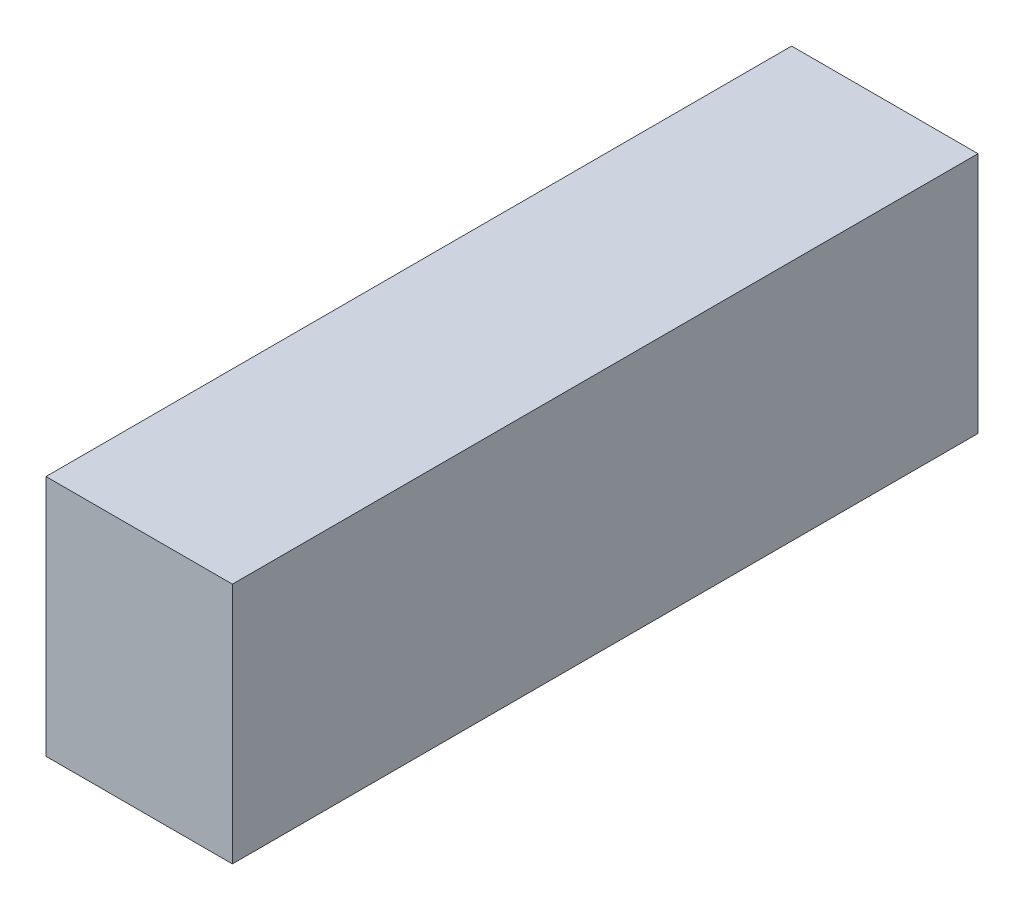
ISO-10303-21;
HEADER;
FILE_DESCRIPTION(('STEP AP214'),'2;1');
FILE_NAME('part.step','',(''),(''),'','','');
FILE_SCHEMA(('AUTOMOTIVE_DESIGN { 1 0 10303 214 1 1 1 1 }'));
ENDSEC;
DATA;
#1=APPLICATION_CONTEXT('core data for automotive mechanical design processes');
#2=APPLICATION_PROTOCOL_DEFINITION('international standard','automotive_design',2000,#1);
#3=PRODUCT_CONTEXT('',#1,'mechanical');
#4=PRODUCT('Part','Part','',(#3));
#5=PRODUCT_RELATED_PRODUCT_CATEGORY('part','',(#4));
#6=PRODUCT_DEFINITION_FORMATION('','',#4);
#7=PRODUCT_DEFINITION_CONTEXT('part definition',#1,'design');
#8=PRODUCT_DEFINITION('design','',#6,#7);
#9=PRODUCT_DEFINITION_SHAPE('','',#8);
#10=(LENGTH_UNIT() NAMED_UNIT(*) SI_UNIT(.MILLI.,.METRE.));
#11=(NAMED_UNIT(*) PLANE_ANGLE_UNIT() SI_UNIT($,.RADIAN.));
#12=(NAMED_UNIT(*) SI_UNIT($,.STERADIAN.) SOLID_ANGLE_UNIT());
#13=UNCERTAINTY_MEASURE_WITH_UNIT(LENGTH_MEASURE(1.E-05),#10,'distance_accuracy_value','');
#14=(GEOMETRIC_REPRESENTATION_CONTEXT(3) GLOBAL_UNCERTAINTY_ASSIGNED_CONTEXT((#13)) GLOBAL_UNIT_ASSIGNED_CONTEXT((#10,
#11,#12)) REPRESENTATION_CONTEXT('',''));
#15=CARTESIAN_POINT('',(0.,0.,0.));
#16=DIRECTION('',(0.,0.,1.));
#17=DIRECTION('',(1.,0.,0.));
#18=AXIS2_PLACEMENT_3D('',#15,#16,#17);
#19=CARTESIAN_POINT('',(10.,0.,0.));
#20=DIRECTION('',(0.,0.,-1.));
#21=DIRECTION('',(-1.,0.,0.));
#22=AXIS2_PLACEMENT_3D('',#19,#20,#21);
#23=PLANE('',#22);
#24=DIRECTION('',(0.,-1.,0.));
#25=VECTOR('',#24,1.);
#26=CARTESIAN_POINT('',(0.,0.,0.));
#27=LINE('',#26,#25);
#28=CARTESIAN_POINT('',(0.,13.,0.));
#29=VERTEX_POINT('',#28);
#30=CARTESIAN_POINT('',(0.,0.,0.));
#31=VERTEX_POINT('',#30);
#32=EDGE_CURVE('E105',#29,#31,#27,.T.);
#33=ORIENTED_EDGE('',*,*,#32,.T.);
#34=DIRECTION('',(-1.,0.,0.));
#35=VECTOR('',#34,1.);
#36=CARTESIAN_POINT('',(10.,0.,0.));
#37=LINE('',#36,#35);
#38=CARTESIAN_POINT('',(10.,0.,0.));
#39=VERTEX_POINT('',#38);
#40=EDGE_CURVE('E11',#39,#31,#37,.T.);
#41=ORIENTED_EDGE('',*,*,#40,.F.);
#42=DIRECTION('',(0.,-1.,0.));
#43=VECTOR('',#42,1.);
#44=CARTESIAN_POINT('',(10.,0.,0.));
#45=LINE('',#44,#43);
#46=CARTESIAN_POINT('',(10.,13.,0.));
#47=VERTEX_POINT('',#46);
#48=EDGE_CURVE('E89',#47,#39,#45,.T.);
#49=ORIENTED_EDGE('',*,*,#48,.F.);
#50=DIRECTION('',(-1.,0.,0.));
#51=VECTOR('',#50,1.);
#52=CARTESIAN_POINT('',(10.,13.,0.));
#53=LINE('',#52,#51);
#54=EDGE_CURVE('E97',#47,#29,#53,.T.);
#55=ORIENTED_EDGE('',*,*,#54,.T.);
#56=EDGE_LOOP('',(#33,#41,#49,#55));
#57=FACE_BOUND('',#56,.T.);
#58=ADVANCED_FACE('F39',(#57),#23,.F.);
#59=CARTESIAN_POINT('',(10.,0.,0.));
#60=DIRECTION('',(0.,1.,0.));
#61=DIRECTION('',(0.,0.,1.));
#62=AXIS2_PLACEMENT_3D('',#59,#60,#61);
#63=PLANE('',#62);
#64=DIRECTION('',(0.,0.,-1.));
#65=VECTOR('',#64,1.);
#66=CARTESIAN_POINT('',(0.,0.,0.));
#67=LINE('',#66,#65);
#68=CARTESIAN_POINT('',(0.,0.,-40.));
#69=VERTEX_POINT('',#68);
#70=EDGE_CURVE('E92',#31,#69,#67,.T.);
#71=ORIENTED_EDGE('',*,*,#70,.T.);
#72=DIRECTION('',(-1.,0.,0.));
#73=VECTOR('',#72,1.);
#74=CARTESIAN_POINT('',(10.,0.,-40.));
#75=LINE('',#74,#73);
#76=CARTESIAN_POINT('',(10.,0.,-40.));
#77=VERTEX_POINT('',#76);
#78=EDGE_CURVE('E50',#77,#69,#75,.T.);
#79=ORIENTED_EDGE('',*,*,#78,.F.);
#80=DIRECTION('',(0.,0.,-1.));
#81=VECTOR('',#80,1.);
#82=CARTESIAN_POINT('',(10.,0.,0.));
#83=LINE('',#82,#81);
#84=EDGE_CURVE('E82',#39,#77,#83,.T.);
#85=ORIENTED_EDGE('',*,*,#84,.F.);
#86=ORIENTED_EDGE('',*,*,#40,.T.);
#87=EDGE_LOOP('',(#71,#79,#85,#86));
#88=FACE_BOUND('',#87,.T.);
#89=ADVANCED_FACE('F93',(#88),#63,.F.);
#90=CARTESIAN_POINT('',(10.,0.,-40.));
#91=DIRECTION('',(0.,0.,1.));
#92=DIRECTION('',(1.,0.,0.));
#93=AXIS2_PLACEMENT_3D('',#90,#91,#92);
#94=PLANE('',#93);
#95=DIRECTION('',(0.,1.,0.));
#96=VECTOR('',#95,1.);
#97=CARTESIAN_POINT('',(0.,0.,-40.));
#98=LINE('',#97,#96);
#99=CARTESIAN_POINT('',(0.,13.,-40.));
#100=VERTEX_POINT('',#99);
#101=EDGE_CURVE('E72',#69,#100,#98,.T.);
#102=ORIENTED_EDGE('',*,*,#101,.T.);
#103=DIRECTION('',(-1.,0.,0.));
#104=VECTOR('',#103,1.);
#105=CARTESIAN_POINT('',(10.,13.,-40.));
#106=LINE('',#105,#104);
#107=CARTESIAN_POINT('',(10.,13.,-40.));
#108=VERTEX_POINT('',#107);
#109=EDGE_CURVE('E94',#108,#100,#106,.T.);
#110=ORIENTED_EDGE('',*,*,#109,.F.);
#111=DIRECTION('',(0.,1.,0.));
#112=VECTOR('',#111,1.);
#113=CARTESIAN_POINT('',(10.,0.,-40.));
#114=LINE('',#113,#112);
#115=EDGE_CURVE('E88',#77,#108,#114,.T.);
#116=ORIENTED_EDGE('',*,*,#115,.F.);
#117=ORIENTED_EDGE('',*,*,#78,.T.);
#118=EDGE_LOOP('',(#102,#110,#116,#117));
#119=FACE_BOUND('',#118,.T.);
#120=ADVANCED_FACE('F96',(#119),#94,.F.);
#121=CARTESIAN_POINT('',(10.,13.,0.));
#122=DIRECTION('',(0.,-1.,0.));
#123=DIRECTION('',(0.,0.,-1.));
#124=AXIS2_PLACEMENT_3D('',#121,#122,#123);
#125=PLANE('',#124);
#126=DIRECTION('',(0.,0.,1.));
#127=VECTOR('',#126,1.);
#128=CARTESIAN_POINT('',(0.,13.,0.));
#129=LINE('',#128,#127);
#130=EDGE_CURVE('E76',#100,#29,#129,.T.);
#131=ORIENTED_EDGE('',*,*,#130,.T.);
#132=ORIENTED_EDGE('',*,*,#54,.F.);
#133=DIRECTION('',(0.,0.,1.));
#134=VECTOR('',#133,1.);
#135=CARTESIAN_POINT('',(10.,13.,0.));
#136=LINE('',#135,#134);
#137=EDGE_CURVE('E54',#108,#47,#136,.T.);
#138=ORIENTED_EDGE('',*,*,#137,.F.);
#139=ORIENTED_EDGE('',*,*,#109,.T.);
#140=EDGE_LOOP('',(#131,#132,#138,#139));
#141=FACE_BOUND('',#140,.T.);
#142=ADVANCED_FACE('F108',(#141),#125,.F.);
#143=CARTESIAN_POINT('',(10.,0.,0.));
#144=DIRECTION('',(-1.,0.,0.));
#145=DIRECTION('',(0.,0.,1.));
#146=AXIS2_PLACEMENT_3D('',#143,#144,#145);
#147=PLANE('',#146);
#148=ORIENTED_EDGE('',*,*,#48,.T.);
#149=ORIENTED_EDGE('',*,*,#84,.T.);
#150=ORIENTED_EDGE('',*,*,#115,.T.);
#151=ORIENTED_EDGE('',*,*,#137,.T.);
#152=EDGE_LOOP('',(#148,#149,#150,#151));
#153=FACE_BOUND('',#152,.T.);
#154=ADVANCED_FACE('F86',(#153),#147,.F.);
#155=CARTESIAN_POINT('',(0.,0.,0.));
#156=DIRECTION('',(-1.,0.,0.));
#157=DIRECTION('',(0.,0.,1.));
#158=AXIS2_PLACEMENT_3D('',#155,#156,#157);
#159=PLANE('',#158);
#160=ORIENTED_EDGE('',*,*,#32,.F.);
#161=ORIENTED_EDGE('',*,*,#130,.F.);
#162=ORIENTED_EDGE('',*,*,#101,.F.);
#163=ORIENTED_EDGE('',*,*,#70,.F.);
#164=EDGE_LOOP('',(#160,#161,#162,#163));
#165=FACE_BOUND('',#164,.T.);
#166=ADVANCED_FACE('F115',(#165),#159,.T.);
#167=CLOSED_SHELL('',(#58,#89,#120,#142,#154,#166));
#168=MANIFOLD_SOLID_BREP('B2',#167);
#169=ADVANCED_BREP_SHAPE_REPRESENTATION('',(#18,#168),#14);
#170=SHAPE_DEFINITION_REPRESENTATION(#9,#169);
ENDSEC;
END-ISO-10303-21;
